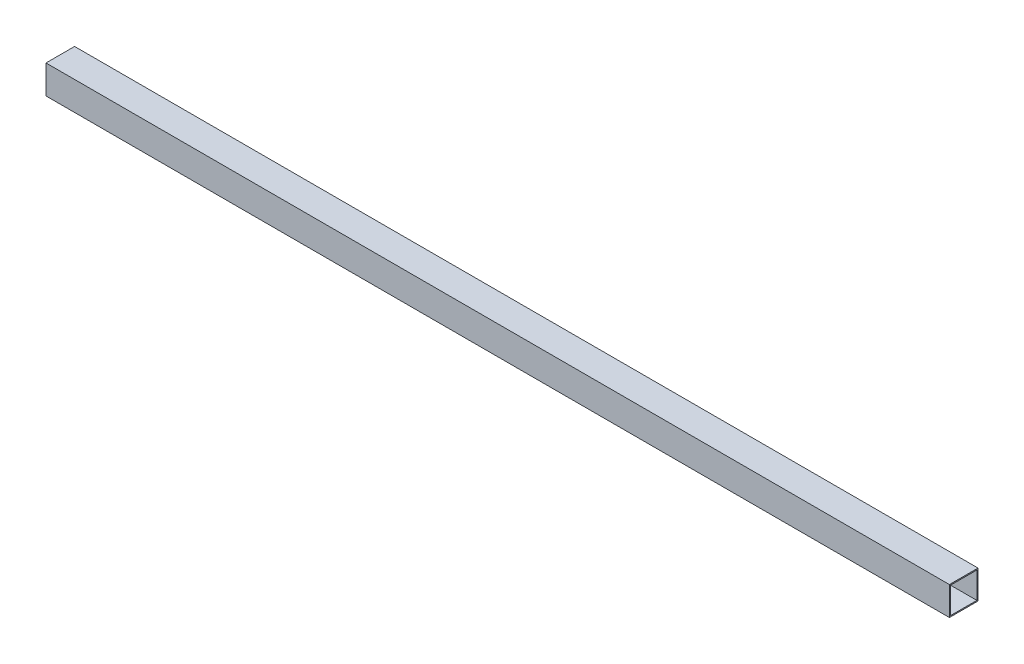
ISO-10303-21;
HEADER;
FILE_DESCRIPTION(('STEP AP214'),'2;1');
FILE_NAME('part.step','',(''),(''),'','','');
FILE_SCHEMA(('AUTOMOTIVE_DESIGN { 1 0 10303 214 1 1 1 1 }'));
ENDSEC;
DATA;
#1=APPLICATION_CONTEXT('core data for automotive mechanical design processes');
#2=APPLICATION_PROTOCOL_DEFINITION('international standard','automotive_design',2000,#1);
#3=PRODUCT_CONTEXT('',#1,'mechanical');
#4=PRODUCT('Part','Part','',(#3));
#5=PRODUCT_RELATED_PRODUCT_CATEGORY('part','',(#4));
#6=PRODUCT_DEFINITION_FORMATION('','',#4);
#7=PRODUCT_DEFINITION_CONTEXT('part definition',#1,'design');
#8=PRODUCT_DEFINITION('design','',#6,#7);
#9=PRODUCT_DEFINITION_SHAPE('','',#8);
#10=(LENGTH_UNIT() NAMED_UNIT(*) SI_UNIT(.MILLI.,.METRE.));
#11=(NAMED_UNIT(*) PLANE_ANGLE_UNIT() SI_UNIT($,.RADIAN.));
#12=(NAMED_UNIT(*) SI_UNIT($,.STERADIAN.) SOLID_ANGLE_UNIT());
#13=UNCERTAINTY_MEASURE_WITH_UNIT(LENGTH_MEASURE(1.E-05),#10,'distance_accuracy_value','');
#14=(GEOMETRIC_REPRESENTATION_CONTEXT(3) GLOBAL_UNCERTAINTY_ASSIGNED_CONTEXT((#13)) GLOBAL_UNIT_ASSIGNED_CONTEXT((#10,
#11,#12)) REPRESENTATION_CONTEXT('',''));
#15=CARTESIAN_POINT('',(0.,0.,0.));
#16=DIRECTION('',(0.,0.,1.));
#17=DIRECTION('',(1.,0.,0.));
#18=AXIS2_PLACEMENT_3D('',#15,#16,#17);
#19=CARTESIAN_POINT('',(-790.,639.,798.));
#20=DIRECTION('',(0.,0.,1.));
#21=DIRECTION('',(1.,0.,0.));
#22=AXIS2_PLACEMENT_3D('',#19,#20,#21);
#23=PLANE('',#22);
#24=DIRECTION('',(0.,-1.,0.));
#25=VECTOR('',#24,1.);
#26=CARTESIAN_POINT('',(790.,662.,798.));
#27=LINE('',#26,#25);
#28=CARTESIAN_POINT('',(790.,685.,798.));
#29=VERTEX_POINT('',#28);
#30=CARTESIAN_POINT('',(790.,639.,798.));
#31=VERTEX_POINT('',#30);
#32=EDGE_CURVE('E151',#29,#31,#27,.T.);
#33=ORIENTED_EDGE('',*,*,#32,.T.);
#34=DIRECTION('',(-1.,0.,0.));
#35=VECTOR('',#34,1.);
#36=CARTESIAN_POINT('',(0.,639.,798.));
#37=LINE('',#36,#35);
#38=CARTESIAN_POINT('',(-790.,639.,798.));
#39=VERTEX_POINT('',#38);
#40=EDGE_CURVE('E80',#31,#39,#37,.T.);
#41=ORIENTED_EDGE('',*,*,#40,.T.);
#42=DIRECTION('',(0.,1.,0.));
#43=VECTOR('',#42,1.);
#44=CARTESIAN_POINT('',(-790.,662.,798.));
#45=LINE('',#44,#43);
#46=CARTESIAN_POINT('',(-790.,685.,798.));
#47=VERTEX_POINT('',#46);
#48=EDGE_CURVE('E98',#39,#47,#45,.T.);
#49=ORIENTED_EDGE('',*,*,#48,.T.);
#50=DIRECTION('',(1.,0.,0.));
#51=VECTOR('',#50,1.);
#52=CARTESIAN_POINT('',(0.,685.,798.));
#53=LINE('',#52,#51);
#54=EDGE_CURVE('E85',#47,#29,#53,.T.);
#55=ORIENTED_EDGE('',*,*,#54,.T.);
#56=EDGE_LOOP('',(#33,#41,#49,#55));
#57=FACE_BOUND('',#56,.T.);
#58=ADVANCED_FACE('F16',(#57),#23,.F.);
#59=CARTESIAN_POINT('',(790.,637.,800.));
#60=DIRECTION('',(0.,0.,-1.));
#61=DIRECTION('',(-1.,0.,0.));
#62=AXIS2_PLACEMENT_3D('',#59,#60,#61);
#63=PLANE('',#62);
#64=DIRECTION('',(0.,-1.,0.));
#65=VECTOR('',#64,1.);
#66=CARTESIAN_POINT('',(-790.,662.,800.));
#67=LINE('',#66,#65);
#68=CARTESIAN_POINT('',(-790.,687.,800.));
#69=VERTEX_POINT('',#68);
#70=CARTESIAN_POINT('',(-790.,637.,800.));
#71=VERTEX_POINT('',#70);
#72=EDGE_CURVE('E103',#69,#71,#67,.T.);
#73=ORIENTED_EDGE('',*,*,#72,.T.);
#74=DIRECTION('',(1.,0.,0.));
#75=VECTOR('',#74,1.);
#76=CARTESIAN_POINT('',(0.,637.,800.));
#77=LINE('',#76,#75);
#78=CARTESIAN_POINT('',(790.,637.,800.));
#79=VERTEX_POINT('',#78);
#80=EDGE_CURVE('E108',#71,#79,#77,.T.);
#81=ORIENTED_EDGE('',*,*,#80,.T.);
#82=DIRECTION('',(0.,1.,0.));
#83=VECTOR('',#82,1.);
#84=CARTESIAN_POINT('',(790.,662.,800.));
#85=LINE('',#84,#83);
#86=CARTESIAN_POINT('',(790.,687.,800.));
#87=VERTEX_POINT('',#86);
#88=EDGE_CURVE('E154',#79,#87,#85,.T.);
#89=ORIENTED_EDGE('',*,*,#88,.T.);
#90=DIRECTION('',(-1.,0.,0.));
#91=VECTOR('',#90,1.);
#92=CARTESIAN_POINT('',(0.,687.,800.));
#93=LINE('',#92,#91);
#94=EDGE_CURVE('E145',#87,#69,#93,.T.);
#95=ORIENTED_EDGE('',*,*,#94,.T.);
#96=EDGE_LOOP('',(#73,#81,#89,#95));
#97=FACE_BOUND('',#96,.T.);
#98=ADVANCED_FACE('F161',(#97),#63,.F.);
#99=CARTESIAN_POINT('',(-790.,685.,752.));
#100=DIRECTION('',(0.,1.,0.));
#101=DIRECTION('',(0.,0.,1.));
#102=AXIS2_PLACEMENT_3D('',#99,#100,#101);
#103=PLANE('',#102);
#104=DIRECTION('',(0.,0.,1.));
#105=VECTOR('',#104,1.);
#106=CARTESIAN_POINT('',(790.,685.,775.));
#107=LINE('',#106,#105);
#108=CARTESIAN_POINT('',(790.,685.,752.));
#109=VERTEX_POINT('',#108);
#110=EDGE_CURVE('E91',#109,#29,#107,.T.);
#111=ORIENTED_EDGE('',*,*,#110,.T.);
#112=ORIENTED_EDGE('',*,*,#54,.F.);
#113=DIRECTION('',(0.,0.,-1.));
#114=VECTOR('',#113,1.);
#115=CARTESIAN_POINT('',(-790.,685.,775.));
#116=LINE('',#115,#114);
#117=CARTESIAN_POINT('',(-790.,685.,752.));
#118=VERTEX_POINT('',#117);
#119=EDGE_CURVE('E89',#47,#118,#116,.T.);
#120=ORIENTED_EDGE('',*,*,#119,.T.);
#121=DIRECTION('',(1.,0.,0.));
#122=VECTOR('',#121,1.);
#123=CARTESIAN_POINT('',(0.,685.,752.));
#124=LINE('',#123,#122);
#125=EDGE_CURVE('E139',#118,#109,#124,.T.);
#126=ORIENTED_EDGE('',*,*,#125,.T.);
#127=EDGE_LOOP('',(#111,#112,#120,#126));
#128=FACE_BOUND('',#127,.T.);
#129=ADVANCED_FACE('F87',(#128),#103,.F.);
#130=CARTESIAN_POINT('',(-790.,639.,798.));
#131=DIRECTION('',(0.,-1.,0.));
#132=DIRECTION('',(0.,0.,-1.));
#133=AXIS2_PLACEMENT_3D('',#130,#131,#132);
#134=PLANE('',#133);
#135=DIRECTION('',(0.,0.,-1.));
#136=VECTOR('',#135,1.);
#137=CARTESIAN_POINT('',(790.,639.,775.));
#138=LINE('',#137,#136);
#139=CARTESIAN_POINT('',(790.,639.,752.));
#140=VERTEX_POINT('',#139);
#141=EDGE_CURVE('E149',#31,#140,#138,.T.);
#142=ORIENTED_EDGE('',*,*,#141,.T.);
#143=DIRECTION('',(-1.,0.,0.));
#144=VECTOR('',#143,1.);
#145=CARTESIAN_POINT('',(0.,639.,752.));
#146=LINE('',#145,#144);
#147=CARTESIAN_POINT('',(-790.,639.,752.));
#148=VERTEX_POINT('',#147);
#149=EDGE_CURVE('E133',#140,#148,#146,.T.);
#150=ORIENTED_EDGE('',*,*,#149,.T.);
#151=DIRECTION('',(0.,0.,1.));
#152=VECTOR('',#151,1.);
#153=CARTESIAN_POINT('',(-790.,639.,775.));
#154=LINE('',#153,#152);
#155=EDGE_CURVE('E102',#148,#39,#154,.T.);
#156=ORIENTED_EDGE('',*,*,#155,.T.);
#157=ORIENTED_EDGE('',*,*,#40,.F.);
#158=EDGE_LOOP('',(#142,#150,#156,#157));
#159=FACE_BOUND('',#158,.T.);
#160=ADVANCED_FACE('F199',(#159),#134,.F.);
#161=CARTESIAN_POINT('',(-790.,637.,800.));
#162=DIRECTION('',(1.,0.,0.));
#163=DIRECTION('',(0.,0.,-1.));
#164=AXIS2_PLACEMENT_3D('',#161,#162,#163);
#165=PLANE('',#164);
#166=ORIENTED_EDGE('',*,*,#155,.F.);
#167=DIRECTION('',(0.,1.,0.));
#168=VECTOR('',#167,1.);
#169=CARTESIAN_POINT('',(-790.,662.,752.));
#170=LINE('',#169,#168);
#171=EDGE_CURVE('E101',#148,#118,#170,.T.);
#172=ORIENTED_EDGE('',*,*,#171,.T.);
#173=ORIENTED_EDGE('',*,*,#119,.F.);
#174=ORIENTED_EDGE('',*,*,#48,.F.);
#175=EDGE_LOOP('',(#166,#172,#173,#174));
#176=FACE_BOUND('',#175,.T.);
#177=DIRECTION('',(0.,0.,-1.));
#178=VECTOR('',#177,1.);
#179=CARTESIAN_POINT('',(-790.,687.,775.));
#180=LINE('',#179,#178);
#181=CARTESIAN_POINT('',(-790.,687.,750.));
#182=VERTEX_POINT('',#181);
#183=EDGE_CURVE('E142',#69,#182,#180,.T.);
#184=ORIENTED_EDGE('',*,*,#183,.T.);
#185=DIRECTION('',(0.,-1.,0.));
#186=VECTOR('',#185,1.);
#187=CARTESIAN_POINT('',(-790.,662.,750.));
#188=LINE('',#187,#186);
#189=CARTESIAN_POINT('',(-790.,637.,750.));
#190=VERTEX_POINT('',#189);
#191=EDGE_CURVE('E130',#182,#190,#188,.T.);
#192=ORIENTED_EDGE('',*,*,#191,.T.);
#193=DIRECTION('',(0.,0.,1.));
#194=VECTOR('',#193,1.);
#195=CARTESIAN_POINT('',(-790.,637.,775.));
#196=LINE('',#195,#194);
#197=EDGE_CURVE('E105',#190,#71,#196,.T.);
#198=ORIENTED_EDGE('',*,*,#197,.T.);
#199=ORIENTED_EDGE('',*,*,#72,.F.);
#200=EDGE_LOOP('',(#184,#192,#198,#199));
#201=FACE_BOUND('',#200,.T.);
#202=ADVANCED_FACE('F96',(#176,#201),#165,.F.);
#203=CARTESIAN_POINT('',(-790.,637.,750.));
#204=DIRECTION('',(0.,1.,0.));
#205=DIRECTION('',(0.,0.,1.));
#206=AXIS2_PLACEMENT_3D('',#203,#204,#205);
#207=PLANE('',#206);
#208=ORIENTED_EDGE('',*,*,#197,.F.);
#209=DIRECTION('',(1.,0.,0.));
#210=VECTOR('',#209,1.);
#211=CARTESIAN_POINT('',(0.,637.,750.));
#212=LINE('',#211,#210);
#213=CARTESIAN_POINT('',(790.,637.,750.));
#214=VERTEX_POINT('',#213);
#215=EDGE_CURVE('E125',#190,#214,#212,.T.);
#216=ORIENTED_EDGE('',*,*,#215,.T.);
#217=DIRECTION('',(0.,0.,1.));
#218=VECTOR('',#217,1.);
#219=CARTESIAN_POINT('',(790.,637.,775.));
#220=LINE('',#219,#218);
#221=EDGE_CURVE('E156',#214,#79,#220,.T.);
#222=ORIENTED_EDGE('',*,*,#221,.T.);
#223=ORIENTED_EDGE('',*,*,#80,.F.);
#224=EDGE_LOOP('',(#208,#216,#222,#223));
#225=FACE_BOUND('',#224,.T.);
#226=ADVANCED_FACE('F166',(#225),#207,.F.);
#227=CARTESIAN_POINT('',(790.,637.,750.));
#228=DIRECTION('',(-1.,0.,0.));
#229=DIRECTION('',(0.,0.,1.));
#230=AXIS2_PLACEMENT_3D('',#227,#228,#229);
#231=PLANE('',#230);
#232=ORIENTED_EDGE('',*,*,#141,.F.);
#233=ORIENTED_EDGE('',*,*,#32,.F.);
#234=ORIENTED_EDGE('',*,*,#110,.F.);
#235=DIRECTION('',(0.,-1.,0.));
#236=VECTOR('',#235,1.);
#237=CARTESIAN_POINT('',(790.,662.,752.));
#238=LINE('',#237,#236);
#239=EDGE_CURVE('E136',#109,#140,#238,.T.);
#240=ORIENTED_EDGE('',*,*,#239,.T.);
#241=EDGE_LOOP('',(#232,#233,#234,#240));
#242=FACE_BOUND('',#241,.T.);
#243=ORIENTED_EDGE('',*,*,#88,.F.);
#244=ORIENTED_EDGE('',*,*,#221,.F.);
#245=DIRECTION('',(0.,1.,0.));
#246=VECTOR('',#245,1.);
#247=CARTESIAN_POINT('',(790.,662.,750.));
#248=LINE('',#247,#246);
#249=CARTESIAN_POINT('',(790.,687.,750.));
#250=VERTEX_POINT('',#249);
#251=EDGE_CURVE('E121',#214,#250,#248,.T.);
#252=ORIENTED_EDGE('',*,*,#251,.T.);
#253=DIRECTION('',(0.,0.,1.));
#254=VECTOR('',#253,1.);
#255=CARTESIAN_POINT('',(790.,687.,775.));
#256=LINE('',#255,#254);
#257=EDGE_CURVE('E35',#250,#87,#256,.T.);
#258=ORIENTED_EDGE('',*,*,#257,.T.);
#259=EDGE_LOOP('',(#243,#244,#252,#258));
#260=FACE_BOUND('',#259,.T.);
#261=ADVANCED_FACE('F164',(#242,#260),#231,.F.);
#262=CARTESIAN_POINT('',(-790.,687.,800.));
#263=DIRECTION('',(0.,-1.,0.));
#264=DIRECTION('',(0.,0.,-1.));
#265=AXIS2_PLACEMENT_3D('',#262,#263,#264);
#266=PLANE('',#265);
#267=ORIENTED_EDGE('',*,*,#183,.F.);
#268=ORIENTED_EDGE('',*,*,#94,.F.);
#269=ORIENTED_EDGE('',*,*,#257,.F.);
#270=DIRECTION('',(-1.,0.,0.));
#271=VECTOR('',#270,1.);
#272=CARTESIAN_POINT('',(0.,687.,750.));
#273=LINE('',#272,#271);
#274=EDGE_CURVE('E118',#250,#182,#273,.T.);
#275=ORIENTED_EDGE('',*,*,#274,.T.);
#276=EDGE_LOOP('',(#267,#268,#269,#275));
#277=FACE_BOUND('',#276,.T.);
#278=ADVANCED_FACE('F169',(#277),#266,.F.);
#279=CARTESIAN_POINT('',(-782.,681.,752.));
#280=DIRECTION('',(0.,0.,-1.));
#281=DIRECTION('',(-1.,0.,0.));
#282=AXIS2_PLACEMENT_3D('',#279,#280,#281);
#283=CYLINDRICAL_SURFACE('',#282,2.60000000000005);
#284=CARTESIAN_POINT('',(-782.,681.,752.));
#285=DIRECTION('',(0.,0.,-1.));
#286=DIRECTION('',(-1.,0.,0.));
#287=AXIS2_PLACEMENT_3D('',#284,#285,#286);
#288=CIRCLE('',#287,2.60000000000005);
#289=CARTESIAN_POINT('',(-784.6,681.,752.));
#290=VERTEX_POINT('',#289);
#291=EDGE_CURVE('E20',#290,#290,#288,.F.);
#292=ORIENTED_EDGE('',*,*,#291,.T.);
#293=EDGE_LOOP('',(#292));
#294=FACE_BOUND('',#293,.T.);
#295=CARTESIAN_POINT('',(-782.,681.,750.));
#296=DIRECTION('',(0.,0.,-1.));
#297=DIRECTION('',(-1.,0.,0.));
#298=AXIS2_PLACEMENT_3D('',#295,#296,#297);
#299=CIRCLE('',#298,2.60000000000005);
#300=CARTESIAN_POINT('',(-784.6,681.,750.));
#301=VERTEX_POINT('',#300);
#302=EDGE_CURVE('E116',#301,#301,#299,.T.);
#303=ORIENTED_EDGE('',*,*,#302,.T.);
#304=EDGE_LOOP('',(#303));
#305=FACE_BOUND('',#304,.T.);
#306=ADVANCED_FACE('F171',(#294,#305),#283,.F.);
#307=CARTESIAN_POINT('',(790.,639.,752.));
#308=DIRECTION('',(0.,0.,-1.));
#309=DIRECTION('',(-1.,0.,0.));
#310=AXIS2_PLACEMENT_3D('',#307,#308,#309);
#311=PLANE('',#310);
#312=ORIENTED_EDGE('',*,*,#291,.F.);
#313=EDGE_LOOP('',(#312));
#314=FACE_BOUND('',#313,.T.);
#315=CARTESIAN_POINT('',(782.,681.,752.));
#316=DIRECTION('',(0.,0.,-1.));
#317=DIRECTION('',(-1.,0.,0.));
#318=AXIS2_PLACEMENT_3D('',#315,#316,#317);
#319=CIRCLE('',#318,2.60000000000005);
#320=CARTESIAN_POINT('',(779.4,681.,752.));
#321=VERTEX_POINT('',#320);
#322=EDGE_CURVE('E26',#321,#321,#319,.F.);
#323=ORIENTED_EDGE('',*,*,#322,.F.);
#324=EDGE_LOOP('',(#323));
#325=FACE_BOUND('',#324,.T.);
#326=ORIENTED_EDGE('',*,*,#239,.F.);
#327=ORIENTED_EDGE('',*,*,#125,.F.);
#328=ORIENTED_EDGE('',*,*,#171,.F.);
#329=ORIENTED_EDGE('',*,*,#149,.F.);
#330=EDGE_LOOP('',(#326,#327,#328,#329));
#331=FACE_BOUND('',#330,.T.);
#332=ADVANCED_FACE('F178',(#314,#325,#331),#311,.F.);
#333=CARTESIAN_POINT('',(-790.,637.,750.));
#334=DIRECTION('',(0.,0.,1.));
#335=DIRECTION('',(1.,0.,0.));
#336=AXIS2_PLACEMENT_3D('',#333,#334,#335);
#337=PLANE('',#336);
#338=ORIENTED_EDGE('',*,*,#302,.F.);
#339=EDGE_LOOP('',(#338));
#340=FACE_BOUND('',#339,.T.);
#341=CARTESIAN_POINT('',(782.,681.,750.));
#342=DIRECTION('',(0.,0.,-1.));
#343=DIRECTION('',(-1.,0.,0.));
#344=AXIS2_PLACEMENT_3D('',#341,#342,#343);
#345=CIRCLE('',#344,2.60000000000005);
#346=CARTESIAN_POINT('',(779.4,681.,750.));
#347=VERTEX_POINT('',#346);
#348=EDGE_CURVE('E11',#347,#347,#345,.T.);
#349=ORIENTED_EDGE('',*,*,#348,.F.);
#350=EDGE_LOOP('',(#349));
#351=FACE_BOUND('',#350,.T.);
#352=ORIENTED_EDGE('',*,*,#251,.F.);
#353=ORIENTED_EDGE('',*,*,#215,.F.);
#354=ORIENTED_EDGE('',*,*,#191,.F.);
#355=ORIENTED_EDGE('',*,*,#274,.F.);
#356=EDGE_LOOP('',(#352,#353,#354,#355));
#357=FACE_BOUND('',#356,.T.);
#358=ADVANCED_FACE('F18',(#340,#351,#357),#337,.F.);
#359=CARTESIAN_POINT('',(782.,681.,752.));
#360=DIRECTION('',(0.,0.,-1.));
#361=DIRECTION('',(-1.,0.,0.));
#362=AXIS2_PLACEMENT_3D('',#359,#360,#361);
#363=CYLINDRICAL_SURFACE('',#362,2.60000000000005);
#364=ORIENTED_EDGE('',*,*,#348,.T.);
#365=EDGE_LOOP('',(#364));
#366=FACE_BOUND('',#365,.T.);
#367=ORIENTED_EDGE('',*,*,#322,.T.);
#368=EDGE_LOOP('',(#367));
#369=FACE_BOUND('',#368,.T.);
#370=ADVANCED_FACE('F183',(#366,#369),#363,.F.);
#371=CLOSED_SHELL('',(#58,#98,#129,#160,#202,#226,#261,#278,#306,#332,#358,#370));
#372=MANIFOLD_SOLID_BREP('B1',#371);
#373=ADVANCED_BREP_SHAPE_REPRESENTATION('',(#18,#372),#14);
#374=SHAPE_DEFINITION_REPRESENTATION(#9,#373);
ENDSEC;
END-ISO-10303-21;
